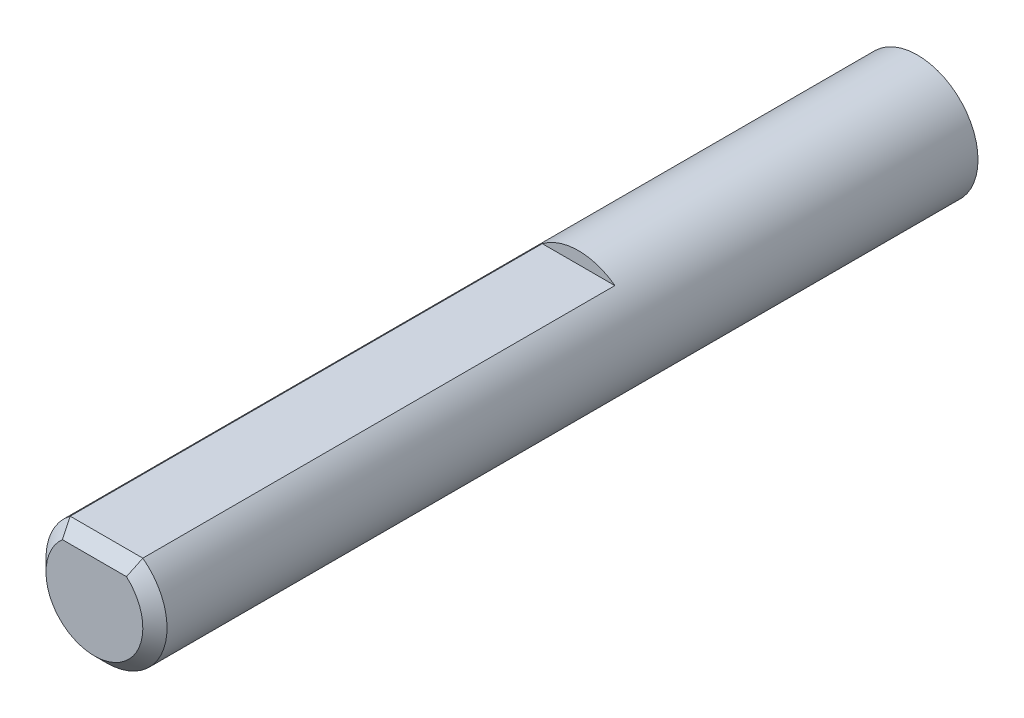
ISO-10303-21;
HEADER;
FILE_DESCRIPTION(('STEP AP214'),'2;1');
FILE_NAME('part.step','',(''),(''),'','','');
FILE_SCHEMA(('AUTOMOTIVE_DESIGN { 1 0 10303 214 1 1 1 1 }'));
ENDSEC;
DATA;
#1=APPLICATION_CONTEXT('core data for automotive mechanical design processes');
#2=APPLICATION_PROTOCOL_DEFINITION('international standard','automotive_design',2000,#1);
#3=PRODUCT_CONTEXT('',#1,'mechanical');
#4=PRODUCT('Part','Part','',(#3));
#5=PRODUCT_RELATED_PRODUCT_CATEGORY('part','',(#4));
#6=PRODUCT_DEFINITION_FORMATION('','',#4);
#7=PRODUCT_DEFINITION_CONTEXT('part definition',#1,'design');
#8=PRODUCT_DEFINITION('design','',#6,#7);
#9=PRODUCT_DEFINITION_SHAPE('','',#8);
#10=(LENGTH_UNIT() NAMED_UNIT(*) SI_UNIT(.MILLI.,.METRE.));
#11=(NAMED_UNIT(*) PLANE_ANGLE_UNIT() SI_UNIT($,.RADIAN.));
#12=(NAMED_UNIT(*) SI_UNIT($,.STERADIAN.) SOLID_ANGLE_UNIT());
#13=UNCERTAINTY_MEASURE_WITH_UNIT(LENGTH_MEASURE(1.E-05),#10,'distance_accuracy_value','');
#14=(GEOMETRIC_REPRESENTATION_CONTEXT(3) GLOBAL_UNCERTAINTY_ASSIGNED_CONTEXT((#13)) GLOBAL_UNIT_ASSIGNED_CONTEXT((#10,
#11,#12)) REPRESENTATION_CONTEXT('',''));
#15=CARTESIAN_POINT('',(0.,0.,0.));
#16=DIRECTION('',(0.,0.,1.));
#17=DIRECTION('',(1.,0.,0.));
#18=AXIS2_PLACEMENT_3D('',#15,#16,#17);
#19=CARTESIAN_POINT('',(0.,0.,34.));
#20=DIRECTION('',(0.,0.,-1.));
#21=DIRECTION('',(-1.,0.,0.));
#22=AXIS2_PLACEMENT_3D('',#19,#20,#21);
#23=CYLINDRICAL_SURFACE('',#22,2.49999999999999);
#24=DIRECTION('',(0.,0.,1.));
#25=VECTOR('',#24,1.);
#26=CARTESIAN_POINT('',(1.5,1.99999999999999,14.));
#27=LINE('',#26,#25);
#28=CARTESIAN_POINT('',(1.5,1.99999999999999,14.));
#29=VERTEX_POINT('',#28);
#30=CARTESIAN_POINT('',(1.5,1.99999999999999,33.5));
#31=VERTEX_POINT('',#30);
#32=EDGE_CURVE('E95',#29,#31,#27,.T.);
#33=ORIENTED_EDGE('',*,*,#32,.T.);
#34=CARTESIAN_POINT('',(0.,0.,33.5));
#35=DIRECTION('',(0.,0.,1.));
#36=DIRECTION('',(1.,0.,0.));
#37=AXIS2_PLACEMENT_3D('',#34,#35,#36);
#38=CIRCLE('',#37,2.49999999999999);
#39=CARTESIAN_POINT('',(-1.5,1.99999999999999,33.5));
#40=VERTEX_POINT('',#39);
#41=EDGE_CURVE('E11',#31,#40,#38,.F.);
#42=ORIENTED_EDGE('',*,*,#41,.T.);
#43=DIRECTION('',(0.,0.,1.));
#44=VECTOR('',#43,1.);
#45=CARTESIAN_POINT('',(-1.5,1.99999999999999,14.));
#46=LINE('',#45,#44);
#47=CARTESIAN_POINT('',(-1.5,1.99999999999999,14.));
#48=VERTEX_POINT('',#47);
#49=EDGE_CURVE('E94',#48,#40,#46,.T.);
#50=ORIENTED_EDGE('',*,*,#49,.F.);
#51=CARTESIAN_POINT('',(0.,0.,14.));
#52=DIRECTION('',(0.,0.,1.));
#53=DIRECTION('',(1.,0.,0.));
#54=AXIS2_PLACEMENT_3D('',#51,#52,#53);
#55=CIRCLE('',#54,2.49999999999999);
#56=EDGE_CURVE('E82',#29,#48,#55,.T.);
#57=ORIENTED_EDGE('',*,*,#56,.F.);
#58=EDGE_LOOP('',(#33,#42,#50,#57));
#59=FACE_BOUND('',#58,.T.);
#60=CARTESIAN_POINT('',(0.,0.,0.));
#61=DIRECTION('',(0.,0.,1.));
#62=DIRECTION('',(1.,0.,0.));
#63=AXIS2_PLACEMENT_3D('',#60,#61,#62);
#64=CIRCLE('',#63,2.49999999999999);
#65=CARTESIAN_POINT('',(2.49999999999999,0.,0.));
#66=VERTEX_POINT('',#65);
#67=EDGE_CURVE('E100',#66,#66,#64,.T.);
#68=ORIENTED_EDGE('',*,*,#67,.T.);
#69=EDGE_LOOP('',(#68));
#70=FACE_BOUND('',#69,.T.);
#71=ADVANCED_FACE('F41',(#59,#70),#23,.T.);
#72=CARTESIAN_POINT('',(0.,0.,34.));
#73=DIRECTION('',(0.,0.,1.));
#74=DIRECTION('',(1.,0.,0.));
#75=AXIS2_PLACEMENT_3D('',#72,#73,#74);
#76=PLANE('',#75);
#77=CARTESIAN_POINT('',(0.,0.,34.));
#78=DIRECTION('',(0.,0.,1.));
#79=DIRECTION('',(1.,0.,0.));
#80=AXIS2_PLACEMENT_3D('',#77,#78,#79);
#81=CIRCLE('',#80,1.99999999999999);
#82=CARTESIAN_POINT('',(-1.32287565553229,1.49999999999999,34.));
#83=VERTEX_POINT('',#82);
#84=CARTESIAN_POINT('',(1.32287565553229,1.49999999999999,34.));
#85=VERTEX_POINT('',#84);
#86=EDGE_CURVE('E62',#83,#85,#81,.T.);
#87=ORIENTED_EDGE('',*,*,#86,.T.);
#88=DIRECTION('',(-1.,0.,0.));
#89=VECTOR('',#88,1.);
#90=CARTESIAN_POINT('',(-1.5,1.49999999999999,34.));
#91=LINE('',#90,#89);
#92=EDGE_CURVE('E55',#85,#83,#91,.T.);
#93=ORIENTED_EDGE('',*,*,#92,.T.);
#94=EDGE_LOOP('',(#87,#93));
#95=FACE_BOUND('',#94,.T.);
#96=ADVANCED_FACE('F121',(#95),#76,.T.);
#97=CARTESIAN_POINT('',(0.,0.,0.));
#98=DIRECTION('',(0.,0.,1.));
#99=DIRECTION('',(1.,0.,0.));
#100=AXIS2_PLACEMENT_3D('',#97,#98,#99);
#101=PLANE('',#100);
#102=ORIENTED_EDGE('',*,*,#67,.F.);
#103=EDGE_LOOP('',(#102));
#104=FACE_BOUND('',#103,.T.);
#105=ADVANCED_FACE('F122',(#104),#101,.F.);
#106=CARTESIAN_POINT('',(-1.5,1.99999999999999,14.));
#107=DIRECTION('',(0.,-1.,0.));
#108=DIRECTION('',(0.,0.,-1.));
#109=AXIS2_PLACEMENT_3D('',#106,#107,#108);
#110=PLANE('',#109);
#111=ORIENTED_EDGE('',*,*,#49,.T.);
#112=DIRECTION('',(1.,0.,0.));
#113=VECTOR('',#112,1.);
#114=CARTESIAN_POINT('',(1.5,1.99999999999999,33.5));
#115=LINE('',#114,#113);
#116=EDGE_CURVE('E105',#40,#31,#115,.T.);
#117=ORIENTED_EDGE('',*,*,#116,.T.);
#118=ORIENTED_EDGE('',*,*,#32,.F.);
#119=DIRECTION('',(1.,0.,0.));
#120=VECTOR('',#119,1.);
#121=CARTESIAN_POINT('',(-1.5,1.99999999999999,14.));
#122=LINE('',#121,#120);
#123=EDGE_CURVE('E85',#48,#29,#122,.T.);
#124=ORIENTED_EDGE('',*,*,#123,.F.);
#125=EDGE_LOOP('',(#111,#117,#118,#124));
#126=FACE_BOUND('',#125,.T.);
#127=ADVANCED_FACE('F92',(#126),#110,.F.);
#128=CARTESIAN_POINT('',(0.,0.,14.));
#129=DIRECTION('',(0.,0.,1.));
#130=DIRECTION('',(1.,0.,0.));
#131=AXIS2_PLACEMENT_3D('',#128,#129,#130);
#132=PLANE('',#131);
#133=ORIENTED_EDGE('',*,*,#56,.T.);
#134=ORIENTED_EDGE('',*,*,#123,.T.);
#135=EDGE_LOOP('',(#133,#134));
#136=FACE_BOUND('',#135,.T.);
#137=ADVANCED_FACE('F84',(#136),#132,.T.);
#138=CARTESIAN_POINT('',(0.,0.,34.));
#139=DIRECTION('',(0.,0.,-1.));
#140=DIRECTION('',(-1.,0.,0.));
#141=AXIS2_PLACEMENT_3D('',#138,#139,#140);
#142=CONICAL_SURFACE('',#141,1.99999999999999,0.785398163397449);
#143=CARTESIAN_POINT('',(1.5,1.99999999999999,33.5));
#144=CARTESIAN_POINT('',(1.48606240845705,1.95818951891393,33.5418104810861));
#145=CARTESIAN_POINT('',(1.47194219050032,1.91640930794318,33.5835906920568));
#146=CARTESIAN_POINT('',(1.44330357435469,1.83291962185563,33.6670803781444));
#147=CARTESIAN_POINT('',(1.42878519796258,1.79121014299888,33.7087898570011));
#148=CARTESIAN_POINT('',(1.39931560745198,1.70786693978759,33.7921330602124));
#149=CARTESIAN_POINT('',(1.38436438703584,1.66623321654463,33.8337667834554));
#150=CARTESIAN_POINT('',(1.35398671696421,1.58305016231494,33.9169498376851));
#151=CARTESIAN_POINT('',(1.33856024136969,1.54150083606693,33.9584991639331));
#152=CARTESIAN_POINT('',(1.32287565553229,1.49999999999999,34.));
#153=B_SPLINE_CURVE_WITH_KNOTS('',3,(#143,#144,#145,#146,#147,#148,#149,#150,#151,#152),
.UNSPECIFIED.,.F.,.F.,(4,2,2,2,4),(0.,0.182248230989352,0.364486504817088,0.54672743145129,
0.72897832232558),.UNSPECIFIED.);
#154=EDGE_CURVE('E108',#85,#31,#153,.F.);
#155=ORIENTED_EDGE('',*,*,#154,.F.);
#156=ORIENTED_EDGE('',*,*,#86,.F.);
#157=CARTESIAN_POINT('',(-1.32287565553229,1.49999999999999,34.));
#158=CARTESIAN_POINT('',(-1.33856024136969,1.54150083606693,33.9584991639331));
#159=CARTESIAN_POINT('',(-1.35398671696421,1.58305016231494,33.9169498376851));
#160=CARTESIAN_POINT('',(-1.38436438703584,1.66623321654463,33.8337667834554));
#161=CARTESIAN_POINT('',(-1.39931560745198,1.70786693978759,33.7921330602124));
#162=CARTESIAN_POINT('',(-1.42878519796258,1.79121014299888,33.7087898570011));
#163=CARTESIAN_POINT('',(-1.44330357435469,1.83291962185563,33.6670803781444));
#164=CARTESIAN_POINT('',(-1.47194219050032,1.91640930794318,33.5835906920568));
#165=CARTESIAN_POINT('',(-1.48606240845705,1.95818951891393,33.5418104810861));
#166=CARTESIAN_POINT('',(-1.5,1.99999999999999,33.5));
#167=B_SPLINE_CURVE_WITH_KNOTS('',3,(#157,#158,#159,#160,#161,#162,#163,#164,#165,#166),
.UNSPECIFIED.,.F.,.F.,(4,2,2,2,4),(0.,0.182250890874289,0.364491817508491,0.546730091336228,
0.728978322325579),.UNSPECIFIED.);
#168=EDGE_CURVE('E46',#40,#83,#167,.F.);
#169=ORIENTED_EDGE('',*,*,#168,.F.);
#170=ORIENTED_EDGE('',*,*,#41,.F.);
#171=EDGE_LOOP('',(#155,#156,#169,#170));
#172=FACE_BOUND('',#171,.T.);
#173=ADVANCED_FACE('F113',(#172),#142,.T.);
#174=CARTESIAN_POINT('',(-1.5,1.99999999999999,33.5));
#175=DIRECTION('',(0.,0.707106781186547,0.707106781186548));
#176=DIRECTION('',(0.,-0.707106781186548,0.707106781186547));
#177=AXIS2_PLACEMENT_3D('',#174,#175,#176);
#178=PLANE('',#177);
#179=ORIENTED_EDGE('',*,*,#168,.T.);
#180=ORIENTED_EDGE('',*,*,#92,.F.);
#181=ORIENTED_EDGE('',*,*,#154,.T.);
#182=ORIENTED_EDGE('',*,*,#116,.F.);
#183=EDGE_LOOP('',(#179,#180,#181,#182));
#184=FACE_BOUND('',#183,.T.);
#185=ADVANCED_FACE('F43',(#184),#178,.T.);
#186=CLOSED_SHELL('',(#71,#96,#105,#127,#137,#173,#185));
#187=MANIFOLD_SOLID_BREP('B2',#186);
#188=ADVANCED_BREP_SHAPE_REPRESENTATION('',(#18,#187),#14);
#189=SHAPE_DEFINITION_REPRESENTATION(#9,#188);
ENDSEC;
END-ISO-10303-21;
